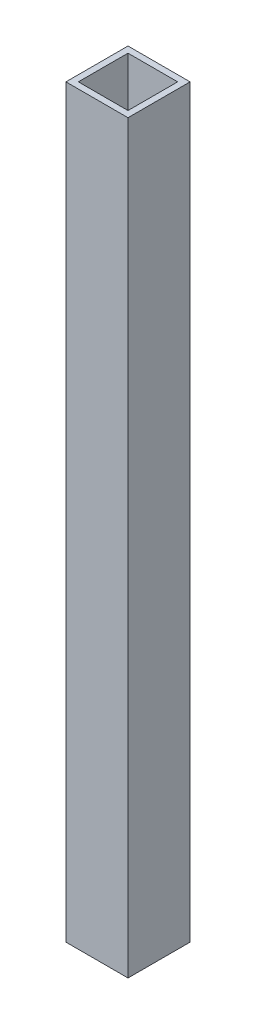
ISO-10303-21;
HEADER;
FILE_DESCRIPTION(('STEP AP214'),'2;1');
FILE_NAME('part.step','',(''),(''),'','','');
FILE_SCHEMA(('AUTOMOTIVE_DESIGN { 1 0 10303 214 1 1 1 1 }'));
ENDSEC;
DATA;
#1=APPLICATION_CONTEXT('core data for automotive mechanical design processes');
#2=APPLICATION_PROTOCOL_DEFINITION('international standard','automotive_design',2000,#1);
#3=PRODUCT_CONTEXT('',#1,'mechanical');
#4=PRODUCT('Part','Part','',(#3));
#5=PRODUCT_RELATED_PRODUCT_CATEGORY('part','',(#4));
#6=PRODUCT_DEFINITION_FORMATION('','',#4);
#7=PRODUCT_DEFINITION_CONTEXT('part definition',#1,'design');
#8=PRODUCT_DEFINITION('design','',#6,#7);
#9=PRODUCT_DEFINITION_SHAPE('','',#8);
#10=(LENGTH_UNIT() NAMED_UNIT(*) SI_UNIT(.MILLI.,.METRE.));
#11=(NAMED_UNIT(*) PLANE_ANGLE_UNIT() SI_UNIT($,.RADIAN.));
#12=(NAMED_UNIT(*) SI_UNIT($,.STERADIAN.) SOLID_ANGLE_UNIT());
#13=UNCERTAINTY_MEASURE_WITH_UNIT(LENGTH_MEASURE(1.E-05),#10,'distance_accuracy_value','');
#14=(GEOMETRIC_REPRESENTATION_CONTEXT(3) GLOBAL_UNCERTAINTY_ASSIGNED_CONTEXT((#13)) GLOBAL_UNIT_ASSIGNED_CONTEXT((#10,
#11,#12)) REPRESENTATION_CONTEXT('',''));
#15=CARTESIAN_POINT('',(0.,0.,0.));
#16=DIRECTION('',(0.,0.,1.));
#17=DIRECTION('',(1.,0.,0.));
#18=AXIS2_PLACEMENT_3D('',#15,#16,#17);
#19=CARTESIAN_POINT('',(0.,240.,0.));
#20=DIRECTION('',(0.,-1.,0.));
#21=DIRECTION('',(0.,0.,-1.));
#22=AXIS2_PLACEMENT_3D('',#19,#20,#21);
#23=PLANE('',#22);
#24=DIRECTION('',(0.,0.,-1.));
#25=VECTOR('',#24,1.);
#26=CARTESIAN_POINT('',(10.,240.,10.));
#27=LINE('',#26,#25);
#28=CARTESIAN_POINT('',(10.,240.,10.));
#29=VERTEX_POINT('',#28);
#30=CARTESIAN_POINT('',(10.,240.,-10.));
#31=VERTEX_POINT('',#30);
#32=EDGE_CURVE('E153',#29,#31,#27,.T.);
#33=ORIENTED_EDGE('',*,*,#32,.T.);
#34=DIRECTION('',(-1.,0.,0.));
#35=VECTOR('',#34,1.);
#36=CARTESIAN_POINT('',(-10.,240.,-10.));
#37=LINE('',#36,#35);
#38=CARTESIAN_POINT('',(-10.,240.,-10.));
#39=VERTEX_POINT('',#38);
#40=EDGE_CURVE('E157',#31,#39,#37,.T.);
#41=ORIENTED_EDGE('',*,*,#40,.T.);
#42=DIRECTION('',(0.,0.,1.));
#43=VECTOR('',#42,1.);
#44=CARTESIAN_POINT('',(-10.,240.,10.));
#45=LINE('',#44,#43);
#46=CARTESIAN_POINT('',(-10.,240.,10.));
#47=VERTEX_POINT('',#46);
#48=EDGE_CURVE('E161',#39,#47,#45,.T.);
#49=ORIENTED_EDGE('',*,*,#48,.T.);
#50=DIRECTION('',(1.,0.,0.));
#51=VECTOR('',#50,1.);
#52=CARTESIAN_POINT('',(-10.,240.,10.));
#53=LINE('',#52,#51);
#54=EDGE_CURVE('E164',#47,#29,#53,.T.);
#55=ORIENTED_EDGE('',*,*,#54,.T.);
#56=EDGE_LOOP('',(#33,#41,#49,#55));
#57=FACE_BOUND('',#56,.T.);
#58=DIRECTION('',(0.,0.,1.));
#59=VECTOR('',#58,1.);
#60=CARTESIAN_POINT('',(-8.,240.,8.));
#61=LINE('',#60,#59);
#62=CARTESIAN_POINT('',(-8.,240.,-8.));
#63=VERTEX_POINT('',#62);
#64=CARTESIAN_POINT('',(-8.,240.,8.));
#65=VERTEX_POINT('',#64);
#66=EDGE_CURVE('E105',#63,#65,#61,.T.);
#67=ORIENTED_EDGE('',*,*,#66,.F.);
#68=DIRECTION('',(-1.,0.,0.));
#69=VECTOR('',#68,1.);
#70=CARTESIAN_POINT('',(-8.,240.,-8.));
#71=LINE('',#70,#69);
#72=CARTESIAN_POINT('',(8.,240.,-8.));
#73=VERTEX_POINT('',#72);
#74=EDGE_CURVE('E131',#73,#63,#71,.T.);
#75=ORIENTED_EDGE('',*,*,#74,.F.);
#76=DIRECTION('',(0.,0.,-1.));
#77=VECTOR('',#76,1.);
#78=CARTESIAN_POINT('',(8.,240.,8.));
#79=LINE('',#78,#77);
#80=CARTESIAN_POINT('',(8.,240.,8.));
#81=VERTEX_POINT('',#80);
#82=EDGE_CURVE('E127',#81,#73,#79,.T.);
#83=ORIENTED_EDGE('',*,*,#82,.F.);
#84=DIRECTION('',(1.,0.,0.));
#85=VECTOR('',#84,1.);
#86=CARTESIAN_POINT('',(-8.,240.,8.));
#87=LINE('',#86,#85);
#88=EDGE_CURVE('E114',#65,#81,#87,.T.);
#89=ORIENTED_EDGE('',*,*,#88,.F.);
#90=EDGE_LOOP('',(#67,#75,#83,#89));
#91=FACE_BOUND('',#90,.T.);
#92=ADVANCED_FACE('F39',(#57,#91),#23,.F.);
#93=CARTESIAN_POINT('',(0.,0.,0.));
#94=DIRECTION('',(0.,-1.,0.));
#95=DIRECTION('',(0.,0.,-1.));
#96=AXIS2_PLACEMENT_3D('',#93,#94,#95);
#97=PLANE('',#96);
#98=DIRECTION('',(0.,0.,-1.));
#99=VECTOR('',#98,1.);
#100=CARTESIAN_POINT('',(10.,0.,10.));
#101=LINE('',#100,#99);
#102=CARTESIAN_POINT('',(10.,0.,10.));
#103=VERTEX_POINT('',#102);
#104=CARTESIAN_POINT('',(10.,0.,-10.));
#105=VERTEX_POINT('',#104);
#106=EDGE_CURVE('E123',#103,#105,#101,.T.);
#107=ORIENTED_EDGE('',*,*,#106,.F.);
#108=DIRECTION('',(1.,0.,0.));
#109=VECTOR('',#108,1.);
#110=CARTESIAN_POINT('',(-10.,0.,10.));
#111=LINE('',#110,#109);
#112=CARTESIAN_POINT('',(-10.,0.,10.));
#113=VERTEX_POINT('',#112);
#114=EDGE_CURVE('E158',#113,#103,#111,.T.);
#115=ORIENTED_EDGE('',*,*,#114,.F.);
#116=DIRECTION('',(0.,0.,1.));
#117=VECTOR('',#116,1.);
#118=CARTESIAN_POINT('',(-10.,0.,10.));
#119=LINE('',#118,#117);
#120=CARTESIAN_POINT('',(-10.,0.,-10.));
#121=VERTEX_POINT('',#120);
#122=EDGE_CURVE('E174',#121,#113,#119,.T.);
#123=ORIENTED_EDGE('',*,*,#122,.F.);
#124=DIRECTION('',(-1.,0.,0.));
#125=VECTOR('',#124,1.);
#126=CARTESIAN_POINT('',(-10.,0.,-10.));
#127=LINE('',#126,#125);
#128=EDGE_CURVE('E171',#105,#121,#127,.T.);
#129=ORIENTED_EDGE('',*,*,#128,.F.);
#130=EDGE_LOOP('',(#107,#115,#123,#129));
#131=FACE_BOUND('',#130,.T.);
#132=DIRECTION('',(-1.,0.,0.));
#133=VECTOR('',#132,1.);
#134=CARTESIAN_POINT('',(-8.,0.,-8.));
#135=LINE('',#134,#133);
#136=CARTESIAN_POINT('',(8.,0.,-8.));
#137=VERTEX_POINT('',#136);
#138=CARTESIAN_POINT('',(-8.,0.,-8.));
#139=VERTEX_POINT('',#138);
#140=EDGE_CURVE('E115',#137,#139,#135,.T.);
#141=ORIENTED_EDGE('',*,*,#140,.T.);
#142=DIRECTION('',(0.,0.,1.));
#143=VECTOR('',#142,1.);
#144=CARTESIAN_POINT('',(-8.,0.,8.));
#145=LINE('',#144,#143);
#146=CARTESIAN_POINT('',(-8.,0.,8.));
#147=VERTEX_POINT('',#146);
#148=EDGE_CURVE('E63',#139,#147,#145,.T.);
#149=ORIENTED_EDGE('',*,*,#148,.T.);
#150=DIRECTION('',(1.,0.,0.));
#151=VECTOR('',#150,1.);
#152=CARTESIAN_POINT('',(-8.,0.,8.));
#153=LINE('',#152,#151);
#154=CARTESIAN_POINT('',(8.,0.,8.));
#155=VERTEX_POINT('',#154);
#156=EDGE_CURVE('E121',#147,#155,#153,.T.);
#157=ORIENTED_EDGE('',*,*,#156,.T.);
#158=DIRECTION('',(0.,0.,-1.));
#159=VECTOR('',#158,1.);
#160=CARTESIAN_POINT('',(8.,0.,8.));
#161=LINE('',#160,#159);
#162=EDGE_CURVE('E140',#155,#137,#161,.T.);
#163=ORIENTED_EDGE('',*,*,#162,.T.);
#164=EDGE_LOOP('',(#141,#149,#157,#163));
#165=FACE_BOUND('',#164,.T.);
#166=ADVANCED_FACE('F197',(#131,#165),#97,.T.);
#167=CARTESIAN_POINT('',(10.,240.,10.));
#168=DIRECTION('',(-1.,0.,0.));
#169=DIRECTION('',(0.,0.,1.));
#170=AXIS2_PLACEMENT_3D('',#167,#168,#169);
#171=PLANE('',#170);
#172=ORIENTED_EDGE('',*,*,#106,.T.);
#173=DIRECTION('',(0.,-1.,0.));
#174=VECTOR('',#173,1.);
#175=CARTESIAN_POINT('',(10.,240.,-10.));
#176=LINE('',#175,#174);
#177=EDGE_CURVE('E11',#31,#105,#176,.T.);
#178=ORIENTED_EDGE('',*,*,#177,.F.);
#179=ORIENTED_EDGE('',*,*,#32,.F.);
#180=DIRECTION('',(0.,-1.,0.));
#181=VECTOR('',#180,1.);
#182=CARTESIAN_POINT('',(10.,240.,10.));
#183=LINE('',#182,#181);
#184=EDGE_CURVE('E167',#29,#103,#183,.T.);
#185=ORIENTED_EDGE('',*,*,#184,.T.);
#186=EDGE_LOOP('',(#172,#178,#179,#185));
#187=FACE_BOUND('',#186,.T.);
#188=ADVANCED_FACE('F41',(#187),#171,.F.);
#189=CARTESIAN_POINT('',(-10.,240.,-10.));
#190=DIRECTION('',(0.,0.,1.));
#191=DIRECTION('',(1.,0.,0.));
#192=AXIS2_PLACEMENT_3D('',#189,#190,#191);
#193=PLANE('',#192);
#194=ORIENTED_EDGE('',*,*,#128,.T.);
#195=DIRECTION('',(0.,-1.,0.));
#196=VECTOR('',#195,1.);
#197=CARTESIAN_POINT('',(-10.,240.,-10.));
#198=LINE('',#197,#196);
#199=EDGE_CURVE('E48',#39,#121,#198,.T.);
#200=ORIENTED_EDGE('',*,*,#199,.F.);
#201=ORIENTED_EDGE('',*,*,#40,.F.);
#202=ORIENTED_EDGE('',*,*,#177,.T.);
#203=EDGE_LOOP('',(#194,#200,#201,#202));
#204=FACE_BOUND('',#203,.T.);
#205=ADVANCED_FACE('F207',(#204),#193,.F.);
#206=CARTESIAN_POINT('',(-10.,240.,10.));
#207=DIRECTION('',(1.,0.,0.));
#208=DIRECTION('',(0.,0.,-1.));
#209=AXIS2_PLACEMENT_3D('',#206,#207,#208);
#210=PLANE('',#209);
#211=ORIENTED_EDGE('',*,*,#122,.T.);
#212=DIRECTION('',(0.,-1.,0.));
#213=VECTOR('',#212,1.);
#214=CARTESIAN_POINT('',(-10.,240.,10.));
#215=LINE('',#214,#213);
#216=EDGE_CURVE('E182',#47,#113,#215,.T.);
#217=ORIENTED_EDGE('',*,*,#216,.F.);
#218=ORIENTED_EDGE('',*,*,#48,.F.);
#219=ORIENTED_EDGE('',*,*,#199,.T.);
#220=EDGE_LOOP('',(#211,#217,#218,#219));
#221=FACE_BOUND('',#220,.T.);
#222=ADVANCED_FACE('F191',(#221),#210,.F.);
#223=CARTESIAN_POINT('',(-10.,240.,10.));
#224=DIRECTION('',(0.,0.,-1.));
#225=DIRECTION('',(-1.,0.,0.));
#226=AXIS2_PLACEMENT_3D('',#223,#224,#225);
#227=PLANE('',#226);
#228=ORIENTED_EDGE('',*,*,#114,.T.);
#229=ORIENTED_EDGE('',*,*,#184,.F.);
#230=ORIENTED_EDGE('',*,*,#54,.F.);
#231=ORIENTED_EDGE('',*,*,#216,.T.);
#232=EDGE_LOOP('',(#228,#229,#230,#231));
#233=FACE_BOUND('',#232,.T.);
#234=ADVANCED_FACE('F201',(#233),#227,.F.);
#235=CARTESIAN_POINT('',(-8.,240.,8.));
#236=DIRECTION('',(1.,0.,0.));
#237=DIRECTION('',(0.,0.,-1.));
#238=AXIS2_PLACEMENT_3D('',#235,#236,#237);
#239=PLANE('',#238);
#240=ORIENTED_EDGE('',*,*,#148,.F.);
#241=DIRECTION('',(0.,-1.,0.));
#242=VECTOR('',#241,1.);
#243=CARTESIAN_POINT('',(-8.,240.,-8.));
#244=LINE('',#243,#242);
#245=EDGE_CURVE('E109',#63,#139,#244,.T.);
#246=ORIENTED_EDGE('',*,*,#245,.F.);
#247=ORIENTED_EDGE('',*,*,#66,.T.);
#248=DIRECTION('',(0.,-1.,0.));
#249=VECTOR('',#248,1.);
#250=CARTESIAN_POINT('',(-8.,240.,8.));
#251=LINE('',#250,#249);
#252=EDGE_CURVE('E108',#65,#147,#251,.T.);
#253=ORIENTED_EDGE('',*,*,#252,.T.);
#254=EDGE_LOOP('',(#240,#246,#247,#253));
#255=FACE_BOUND('',#254,.T.);
#256=ADVANCED_FACE('F107',(#255),#239,.T.);
#257=CARTESIAN_POINT('',(-8.,240.,8.));
#258=DIRECTION('',(0.,0.,-1.));
#259=DIRECTION('',(-1.,0.,0.));
#260=AXIS2_PLACEMENT_3D('',#257,#258,#259);
#261=PLANE('',#260);
#262=ORIENTED_EDGE('',*,*,#156,.F.);
#263=ORIENTED_EDGE('',*,*,#252,.F.);
#264=ORIENTED_EDGE('',*,*,#88,.T.);
#265=DIRECTION('',(0.,-1.,0.));
#266=VECTOR('',#265,1.);
#267=CARTESIAN_POINT('',(8.,240.,8.));
#268=LINE('',#267,#266);
#269=EDGE_CURVE('E124',#81,#155,#268,.T.);
#270=ORIENTED_EDGE('',*,*,#269,.T.);
#271=EDGE_LOOP('',(#262,#263,#264,#270));
#272=FACE_BOUND('',#271,.T.);
#273=ADVANCED_FACE('F118',(#272),#261,.T.);
#274=CARTESIAN_POINT('',(8.,240.,8.));
#275=DIRECTION('',(-1.,0.,0.));
#276=DIRECTION('',(0.,0.,1.));
#277=AXIS2_PLACEMENT_3D('',#274,#275,#276);
#278=PLANE('',#277);
#279=ORIENTED_EDGE('',*,*,#162,.F.);
#280=ORIENTED_EDGE('',*,*,#269,.F.);
#281=ORIENTED_EDGE('',*,*,#82,.T.);
#282=DIRECTION('',(0.,-1.,0.));
#283=VECTOR('',#282,1.);
#284=CARTESIAN_POINT('',(8.,240.,-8.));
#285=LINE('',#284,#283);
#286=EDGE_CURVE('E55',#73,#137,#285,.T.);
#287=ORIENTED_EDGE('',*,*,#286,.T.);
#288=EDGE_LOOP('',(#279,#280,#281,#287));
#289=FACE_BOUND('',#288,.T.);
#290=ADVANCED_FACE('F230',(#289),#278,.T.);
#291=CARTESIAN_POINT('',(-8.,240.,-8.));
#292=DIRECTION('',(0.,0.,1.));
#293=DIRECTION('',(1.,0.,0.));
#294=AXIS2_PLACEMENT_3D('',#291,#292,#293);
#295=PLANE('',#294);
#296=ORIENTED_EDGE('',*,*,#140,.F.);
#297=ORIENTED_EDGE('',*,*,#286,.F.);
#298=ORIENTED_EDGE('',*,*,#74,.T.);
#299=ORIENTED_EDGE('',*,*,#245,.T.);
#300=EDGE_LOOP('',(#296,#297,#298,#299));
#301=FACE_BOUND('',#300,.T.);
#302=ADVANCED_FACE('F234',(#301),#295,.T.);
#303=CLOSED_SHELL('',(#92,#166,#188,#205,#222,#234,#256,#273,#290,#302));
#304=MANIFOLD_SOLID_BREP('B2',#303);
#305=ADVANCED_BREP_SHAPE_REPRESENTATION('',(#18,#304),#14);
#306=SHAPE_DEFINITION_REPRESENTATION(#9,#305);
ENDSEC;
END-ISO-10303-21;
